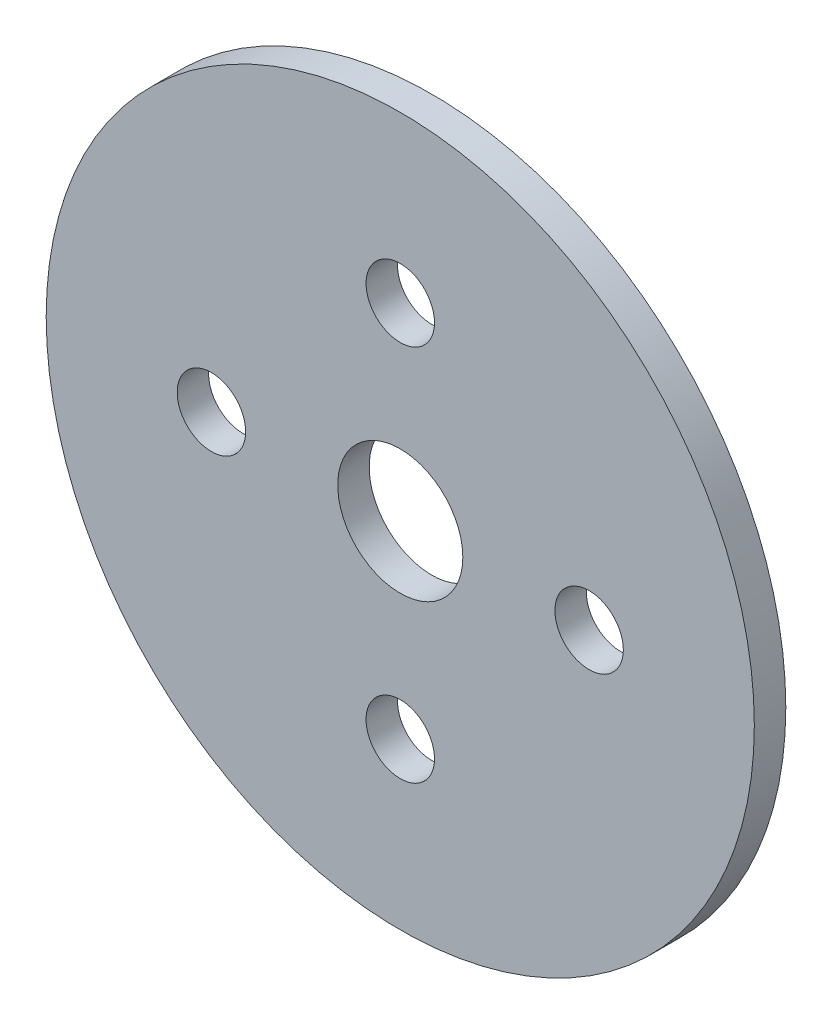
ISO-10303-21;
HEADER;
FILE_DESCRIPTION(('STEP AP214'),'2;1');
FILE_NAME('part.step','',(''),(''),'','','');
FILE_SCHEMA(('AUTOMOTIVE_DESIGN { 1 0 10303 214 1 1 1 1 }'));
ENDSEC;
DATA;
#1=APPLICATION_CONTEXT('core data for automotive mechanical design processes');
#2=APPLICATION_PROTOCOL_DEFINITION('international standard','automotive_design',2000,#1);
#3=PRODUCT_CONTEXT('',#1,'mechanical');
#4=PRODUCT('Part','Part','',(#3));
#5=PRODUCT_RELATED_PRODUCT_CATEGORY('part','',(#4));
#6=PRODUCT_DEFINITION_FORMATION('','',#4);
#7=PRODUCT_DEFINITION_CONTEXT('part definition',#1,'design');
#8=PRODUCT_DEFINITION('design','',#6,#7);
#9=PRODUCT_DEFINITION_SHAPE('','',#8);
#10=(LENGTH_UNIT() NAMED_UNIT(*) SI_UNIT(.MILLI.,.METRE.));
#11=(NAMED_UNIT(*) PLANE_ANGLE_UNIT() SI_UNIT($,.RADIAN.));
#12=(NAMED_UNIT(*) SI_UNIT($,.STERADIAN.) SOLID_ANGLE_UNIT());
#13=UNCERTAINTY_MEASURE_WITH_UNIT(LENGTH_MEASURE(1.E-05),#10,'distance_accuracy_value','');
#14=(GEOMETRIC_REPRESENTATION_CONTEXT(3) GLOBAL_UNCERTAINTY_ASSIGNED_CONTEXT((#13)) GLOBAL_UNIT_ASSIGNED_CONTEXT((#10,
#11,#12)) REPRESENTATION_CONTEXT('',''));
#15=CARTESIAN_POINT('',(0.,0.,0.));
#16=DIRECTION('',(0.,0.,1.));
#17=DIRECTION('',(1.,0.,0.));
#18=AXIS2_PLACEMENT_3D('',#15,#16,#17);
#19=CARTESIAN_POINT('',(0.,0.,2.));
#20=DIRECTION('',(0.,0.,1.));
#21=DIRECTION('',(1.,0.,0.));
#22=AXIS2_PLACEMENT_3D('',#19,#20,#21);
#23=PLANE('',#22);
#24=CARTESIAN_POINT('',(-12.,0.,2.));
#25=DIRECTION('',(0.,0.,1.));
#26=DIRECTION('',(1.,0.,0.));
#27=AXIS2_PLACEMENT_3D('',#24,#25,#26);
#28=CIRCLE('',#27,2.175);
#29=CARTESIAN_POINT('',(-9.825,0.,2.));
#30=VERTEX_POINT('',#29);
#31=EDGE_CURVE('E59',#30,#30,#28,.T.);
#32=ORIENTED_EDGE('',*,*,#31,.F.);
#33=EDGE_LOOP('',(#32));
#34=FACE_BOUND('',#33,.T.);
#35=CARTESIAN_POINT('',(12.,0.,2.));
#36=DIRECTION('',(0.,0.,1.));
#37=DIRECTION('',(1.,0.,0.));
#38=AXIS2_PLACEMENT_3D('',#35,#36,#37);
#39=CIRCLE('',#38,2.175);
#40=CARTESIAN_POINT('',(14.175,0.,2.));
#41=VERTEX_POINT('',#40);
#42=EDGE_CURVE('E47',#41,#41,#39,.T.);
#43=ORIENTED_EDGE('',*,*,#42,.F.);
#44=EDGE_LOOP('',(#43));
#45=FACE_BOUND('',#44,.T.);
#46=CARTESIAN_POINT('',(0.,0.,2.));
#47=DIRECTION('',(0.,0.,1.));
#48=DIRECTION('',(1.,0.,0.));
#49=AXIS2_PLACEMENT_3D('',#46,#47,#48);
#50=CIRCLE('',#49,22.5);
#51=CARTESIAN_POINT('',(22.5,0.,2.));
#52=VERTEX_POINT('',#51);
#53=EDGE_CURVE('E10',#52,#52,#50,.T.);
#54=ORIENTED_EDGE('',*,*,#53,.T.);
#55=EDGE_LOOP('',(#54));
#56=FACE_BOUND('',#55,.T.);
#57=CARTESIAN_POINT('',(0.,0.,2.));
#58=DIRECTION('',(0.,0.,1.));
#59=DIRECTION('',(1.,0.,0.));
#60=AXIS2_PLACEMENT_3D('',#57,#58,#59);
#61=CIRCLE('',#60,3.975);
#62=CARTESIAN_POINT('',(3.975,0.,2.));
#63=VERTEX_POINT('',#62);
#64=EDGE_CURVE('E42',#63,#63,#61,.T.);
#65=ORIENTED_EDGE('',*,*,#64,.F.);
#66=EDGE_LOOP('',(#65));
#67=FACE_BOUND('',#66,.T.);
#68=CARTESIAN_POINT('',(0.,12.,2.));
#69=DIRECTION('',(0.,0.,1.));
#70=DIRECTION('',(1.,0.,0.));
#71=AXIS2_PLACEMENT_3D('',#68,#69,#70);
#72=CIRCLE('',#71,2.175);
#73=CARTESIAN_POINT('',(2.175,12.,2.));
#74=VERTEX_POINT('',#73);
#75=EDGE_CURVE('E53',#74,#74,#72,.T.);
#76=ORIENTED_EDGE('',*,*,#75,.F.);
#77=EDGE_LOOP('',(#76));
#78=FACE_BOUND('',#77,.T.);
#79=CARTESIAN_POINT('',(0.,-12.,2.));
#80=DIRECTION('',(0.,0.,1.));
#81=DIRECTION('',(1.,0.,0.));
#82=AXIS2_PLACEMENT_3D('',#79,#80,#81);
#83=CIRCLE('',#82,2.175);
#84=CARTESIAN_POINT('',(2.175,-12.,2.));
#85=VERTEX_POINT('',#84);
#86=EDGE_CURVE('E65',#85,#85,#83,.T.);
#87=ORIENTED_EDGE('',*,*,#86,.F.);
#88=EDGE_LOOP('',(#87));
#89=FACE_BOUND('',#88,.T.);
#90=ADVANCED_FACE('F31',(#34,#45,#56,#67,#78,#89),#23,.T.);
#91=CARTESIAN_POINT('',(0.,0.,0.));
#92=DIRECTION('',(0.,0.,1.));
#93=DIRECTION('',(1.,0.,0.));
#94=AXIS2_PLACEMENT_3D('',#91,#92,#93);
#95=PLANE('',#94);
#96=CARTESIAN_POINT('',(0.,0.,0.));
#97=DIRECTION('',(0.,0.,1.));
#98=DIRECTION('',(1.,0.,0.));
#99=AXIS2_PLACEMENT_3D('',#96,#97,#98);
#100=CIRCLE('',#99,22.5);
#101=CARTESIAN_POINT('',(22.5,0.,0.));
#102=VERTEX_POINT('',#101);
#103=EDGE_CURVE('E35',#102,#102,#100,.T.);
#104=ORIENTED_EDGE('',*,*,#103,.F.);
#105=EDGE_LOOP('',(#104));
#106=FACE_BOUND('',#105,.T.);
#107=CARTESIAN_POINT('',(0.,0.,0.));
#108=DIRECTION('',(0.,0.,1.));
#109=DIRECTION('',(1.,0.,0.));
#110=AXIS2_PLACEMENT_3D('',#107,#108,#109);
#111=CIRCLE('',#110,3.975);
#112=CARTESIAN_POINT('',(3.975,0.,0.));
#113=VERTEX_POINT('',#112);
#114=EDGE_CURVE('E44',#113,#113,#111,.T.);
#115=ORIENTED_EDGE('',*,*,#114,.T.);
#116=EDGE_LOOP('',(#115));
#117=FACE_BOUND('',#116,.T.);
#118=CARTESIAN_POINT('',(12.,0.,0.));
#119=DIRECTION('',(0.,0.,1.));
#120=DIRECTION('',(1.,0.,0.));
#121=AXIS2_PLACEMENT_3D('',#118,#119,#120);
#122=CIRCLE('',#121,2.175);
#123=CARTESIAN_POINT('',(14.175,0.,0.));
#124=VERTEX_POINT('',#123);
#125=EDGE_CURVE('E50',#124,#124,#122,.T.);
#126=ORIENTED_EDGE('',*,*,#125,.T.);
#127=EDGE_LOOP('',(#126));
#128=FACE_BOUND('',#127,.T.);
#129=CARTESIAN_POINT('',(0.,12.,0.));
#130=DIRECTION('',(0.,0.,1.));
#131=DIRECTION('',(1.,0.,0.));
#132=AXIS2_PLACEMENT_3D('',#129,#130,#131);
#133=CIRCLE('',#132,2.175);
#134=CARTESIAN_POINT('',(2.175,12.,0.));
#135=VERTEX_POINT('',#134);
#136=EDGE_CURVE('E56',#135,#135,#133,.T.);
#137=ORIENTED_EDGE('',*,*,#136,.T.);
#138=EDGE_LOOP('',(#137));
#139=FACE_BOUND('',#138,.T.);
#140=CARTESIAN_POINT('',(-12.,0.,0.));
#141=DIRECTION('',(0.,0.,1.));
#142=DIRECTION('',(1.,0.,0.));
#143=AXIS2_PLACEMENT_3D('',#140,#141,#142);
#144=CIRCLE('',#143,2.175);
#145=CARTESIAN_POINT('',(-9.825,0.,0.));
#146=VERTEX_POINT('',#145);
#147=EDGE_CURVE('E62',#146,#146,#144,.T.);
#148=ORIENTED_EDGE('',*,*,#147,.T.);
#149=EDGE_LOOP('',(#148));
#150=FACE_BOUND('',#149,.T.);
#151=CARTESIAN_POINT('',(0.,-12.,0.));
#152=DIRECTION('',(0.,0.,1.));
#153=DIRECTION('',(1.,0.,0.));
#154=AXIS2_PLACEMENT_3D('',#151,#152,#153);
#155=CIRCLE('',#154,2.175);
#156=CARTESIAN_POINT('',(2.175,-12.,0.));
#157=VERTEX_POINT('',#156);
#158=EDGE_CURVE('E68',#157,#157,#155,.T.);
#159=ORIENTED_EDGE('',*,*,#158,.T.);
#160=EDGE_LOOP('',(#159));
#161=FACE_BOUND('',#160,.T.);
#162=ADVANCED_FACE('F78',(#106,#117,#128,#139,#150,#161),#95,.F.);
#163=CARTESIAN_POINT('',(0.,0.,2.));
#164=DIRECTION('',(0.,0.,-1.));
#165=DIRECTION('',(-1.,0.,0.));
#166=AXIS2_PLACEMENT_3D('',#163,#164,#165);
#167=CYLINDRICAL_SURFACE('',#166,22.5);
#168=ORIENTED_EDGE('',*,*,#53,.F.);
#169=EDGE_LOOP('',(#168));
#170=FACE_BOUND('',#169,.T.);
#171=ORIENTED_EDGE('',*,*,#103,.T.);
#172=EDGE_LOOP('',(#171));
#173=FACE_BOUND('',#172,.T.);
#174=ADVANCED_FACE('F33',(#170,#173),#167,.T.);
#175=CARTESIAN_POINT('',(0.,0.,2.));
#176=DIRECTION('',(0.,0.,-1.));
#177=DIRECTION('',(-1.,0.,0.));
#178=AXIS2_PLACEMENT_3D('',#175,#176,#177);
#179=CYLINDRICAL_SURFACE('',#178,3.975);
#180=ORIENTED_EDGE('',*,*,#64,.T.);
#181=EDGE_LOOP('',(#180));
#182=FACE_BOUND('',#181,.T.);
#183=ORIENTED_EDGE('',*,*,#114,.F.);
#184=EDGE_LOOP('',(#183));
#185=FACE_BOUND('',#184,.T.);
#186=ADVANCED_FACE('F88',(#182,#185),#179,.F.);
#187=CARTESIAN_POINT('',(12.,0.,2.));
#188=DIRECTION('',(0.,0.,-1.));
#189=DIRECTION('',(-1.,0.,0.));
#190=AXIS2_PLACEMENT_3D('',#187,#188,#189);
#191=CYLINDRICAL_SURFACE('',#190,2.175);
#192=ORIENTED_EDGE('',*,*,#42,.T.);
#193=EDGE_LOOP('',(#192));
#194=FACE_BOUND('',#193,.T.);
#195=ORIENTED_EDGE('',*,*,#125,.F.);
#196=EDGE_LOOP('',(#195));
#197=FACE_BOUND('',#196,.T.);
#198=ADVANCED_FACE('F91',(#194,#197),#191,.F.);
#199=CARTESIAN_POINT('',(0.,12.,2.));
#200=DIRECTION('',(0.,0.,-1.));
#201=DIRECTION('',(-1.,0.,0.));
#202=AXIS2_PLACEMENT_3D('',#199,#200,#201);
#203=CYLINDRICAL_SURFACE('',#202,2.175);
#204=ORIENTED_EDGE('',*,*,#75,.T.);
#205=EDGE_LOOP('',(#204));
#206=FACE_BOUND('',#205,.T.);
#207=ORIENTED_EDGE('',*,*,#136,.F.);
#208=EDGE_LOOP('',(#207));
#209=FACE_BOUND('',#208,.T.);
#210=ADVANCED_FACE('F95',(#206,#209),#203,.F.);
#211=CARTESIAN_POINT('',(-12.,0.,2.));
#212=DIRECTION('',(0.,0.,-1.));
#213=DIRECTION('',(-1.,0.,0.));
#214=AXIS2_PLACEMENT_3D('',#211,#212,#213);
#215=CYLINDRICAL_SURFACE('',#214,2.175);
#216=ORIENTED_EDGE('',*,*,#31,.T.);
#217=EDGE_LOOP('',(#216));
#218=FACE_BOUND('',#217,.T.);
#219=ORIENTED_EDGE('',*,*,#147,.F.);
#220=EDGE_LOOP('',(#219));
#221=FACE_BOUND('',#220,.T.);
#222=ADVANCED_FACE('F99',(#218,#221),#215,.F.);
#223=CARTESIAN_POINT('',(0.,-12.,2.));
#224=DIRECTION('',(0.,0.,-1.));
#225=DIRECTION('',(-1.,0.,0.));
#226=AXIS2_PLACEMENT_3D('',#223,#224,#225);
#227=CYLINDRICAL_SURFACE('',#226,2.175);
#228=ORIENTED_EDGE('',*,*,#86,.T.);
#229=EDGE_LOOP('',(#228));
#230=FACE_BOUND('',#229,.T.);
#231=ORIENTED_EDGE('',*,*,#158,.F.);
#232=EDGE_LOOP('',(#231));
#233=FACE_BOUND('',#232,.T.);
#234=ADVANCED_FACE('F74',(#230,#233),#227,.F.);
#235=CLOSED_SHELL('',(#90,#162,#174,#186,#198,#210,#222,#234));
#236=MANIFOLD_SOLID_BREP('B2',#235);
#237=ADVANCED_BREP_SHAPE_REPRESENTATION('',(#18,#236),#14);
#238=SHAPE_DEFINITION_REPRESENTATION(#9,#237);
ENDSEC;
END-ISO-10303-21;
